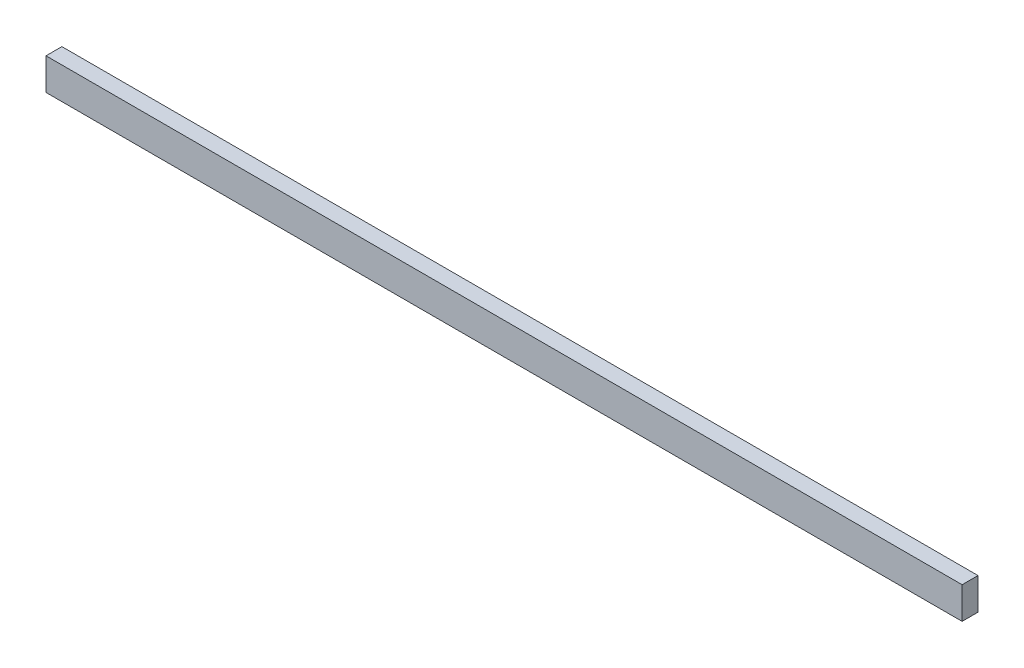
ISO-10303-21;
HEADER;
FILE_DESCRIPTION(('STEP AP214'),'2;1');
FILE_NAME('part.step','',(''),(''),'','','');
FILE_SCHEMA(('AUTOMOTIVE_DESIGN { 1 0 10303 214 1 1 1 1 }'));
ENDSEC;
DATA;
#1=APPLICATION_CONTEXT('core data for automotive mechanical design processes');
#2=APPLICATION_PROTOCOL_DEFINITION('international standard','automotive_design',2000,#1);
#3=PRODUCT_CONTEXT('',#1,'mechanical');
#4=PRODUCT('Part','Part','',(#3));
#5=PRODUCT_RELATED_PRODUCT_CATEGORY('part','',(#4));
#6=PRODUCT_DEFINITION_FORMATION('','',#4);
#7=PRODUCT_DEFINITION_CONTEXT('part definition',#1,'design');
#8=PRODUCT_DEFINITION('design','',#6,#7);
#9=PRODUCT_DEFINITION_SHAPE('','',#8);
#10=(LENGTH_UNIT() NAMED_UNIT(*) SI_UNIT(.MILLI.,.METRE.));
#11=(NAMED_UNIT(*) PLANE_ANGLE_UNIT() SI_UNIT($,.RADIAN.));
#12=(NAMED_UNIT(*) SI_UNIT($,.STERADIAN.) SOLID_ANGLE_UNIT());
#13=UNCERTAINTY_MEASURE_WITH_UNIT(LENGTH_MEASURE(1.E-05),#10,'distance_accuracy_value','');
#14=(GEOMETRIC_REPRESENTATION_CONTEXT(3) GLOBAL_UNCERTAINTY_ASSIGNED_CONTEXT((#13)) GLOBAL_UNIT_ASSIGNED_CONTEXT((#10,
#11,#12)) REPRESENTATION_CONTEXT('',''));
#15=CARTESIAN_POINT('',(0.,0.,0.));
#16=DIRECTION('',(0.,0.,1.));
#17=DIRECTION('',(1.,0.,0.));
#18=AXIS2_PLACEMENT_3D('',#15,#16,#17);
#19=CARTESIAN_POINT('',(-549.275,0.,463.55));
#20=DIRECTION('',(0.,0.,-1.));
#21=DIRECTION('',(-1.,0.,0.));
#22=AXIS2_PLACEMENT_3D('',#19,#20,#21);
#23=PLANE('',#22);
#24=DIRECTION('',(0.,1.,0.));
#25=VECTOR('',#24,1.);
#26=CARTESIAN_POINT('',(549.275,0.,463.55));
#27=LINE('',#26,#25);
#28=CARTESIAN_POINT('',(549.275,0.,463.55));
#29=VERTEX_POINT('',#28);
#30=CARTESIAN_POINT('',(549.275,38.1,463.55));
#31=VERTEX_POINT('',#30);
#32=EDGE_CURVE('E19',#29,#31,#27,.T.);
#33=ORIENTED_EDGE('',*,*,#32,.F.);
#34=DIRECTION('',(1.,0.,0.));
#35=VECTOR('',#34,1.);
#36=CARTESIAN_POINT('',(0.,0.,463.55));
#37=LINE('',#36,#35);
#38=CARTESIAN_POINT('',(-549.275,0.,463.55));
#39=VERTEX_POINT('',#38);
#40=EDGE_CURVE('E79',#39,#29,#37,.T.);
#41=ORIENTED_EDGE('',*,*,#40,.F.);
#42=DIRECTION('',(0.,1.,0.));
#43=VECTOR('',#42,1.);
#44=CARTESIAN_POINT('',(-549.275,0.,463.55));
#45=LINE('',#44,#43);
#46=CARTESIAN_POINT('',(-549.275,38.1,463.55));
#47=VERTEX_POINT('',#46);
#48=EDGE_CURVE('E60',#47,#39,#45,.F.);
#49=ORIENTED_EDGE('',*,*,#48,.F.);
#50=DIRECTION('',(1.,0.,0.));
#51=VECTOR('',#50,1.);
#52=CARTESIAN_POINT('',(0.,38.1,463.55));
#53=LINE('',#52,#51);
#54=EDGE_CURVE('E54',#31,#47,#53,.F.);
#55=ORIENTED_EDGE('',*,*,#54,.F.);
#56=EDGE_LOOP('',(#33,#41,#49,#55));
#57=FACE_BOUND('',#56,.T.);
#58=ADVANCED_FACE('F16',(#57),#23,.T.);
#59=CARTESIAN_POINT('',(549.275,0.,463.55));
#60=DIRECTION('',(1.,0.,0.));
#61=DIRECTION('',(0.,0.,-1.));
#62=AXIS2_PLACEMENT_3D('',#59,#60,#61);
#63=PLANE('',#62);
#64=DIRECTION('',(0.,1.,0.));
#65=VECTOR('',#64,1.);
#66=CARTESIAN_POINT('',(549.275,0.,482.6));
#67=LINE('',#66,#65);
#68=CARTESIAN_POINT('',(549.275,0.,482.6));
#69=VERTEX_POINT('',#68);
#70=CARTESIAN_POINT('',(549.275,38.1,482.6));
#71=VERTEX_POINT('',#70);
#72=EDGE_CURVE('E82',#69,#71,#67,.T.);
#73=ORIENTED_EDGE('',*,*,#72,.F.);
#74=DIRECTION('',(0.,0.,-1.));
#75=VECTOR('',#74,1.);
#76=CARTESIAN_POINT('',(549.275,0.,0.));
#77=LINE('',#76,#75);
#78=EDGE_CURVE('E67',#29,#69,#77,.F.);
#79=ORIENTED_EDGE('',*,*,#78,.F.);
#80=ORIENTED_EDGE('',*,*,#32,.T.);
#81=DIRECTION('',(0.,0.,1.));
#82=VECTOR('',#81,1.);
#83=CARTESIAN_POINT('',(549.275,38.1,0.));
#84=LINE('',#83,#82);
#85=EDGE_CURVE('E62',#71,#31,#84,.F.);
#86=ORIENTED_EDGE('',*,*,#85,.F.);
#87=EDGE_LOOP('',(#73,#79,#80,#86));
#88=FACE_BOUND('',#87,.T.);
#89=ADVANCED_FACE('F64',(#88),#63,.T.);
#90=CARTESIAN_POINT('',(0.,38.1,0.));
#91=DIRECTION('',(0.,1.,0.));
#92=DIRECTION('',(0.,0.,1.));
#93=AXIS2_PLACEMENT_3D('',#90,#91,#92);
#94=PLANE('',#93);
#95=DIRECTION('',(1.,0.,0.));
#96=VECTOR('',#95,1.);
#97=CARTESIAN_POINT('',(549.275,38.1,482.6));
#98=LINE('',#97,#96);
#99=CARTESIAN_POINT('',(-549.275,38.1,482.6));
#100=VERTEX_POINT('',#99);
#101=EDGE_CURVE('E71',#71,#100,#98,.F.);
#102=ORIENTED_EDGE('',*,*,#101,.F.);
#103=ORIENTED_EDGE('',*,*,#85,.T.);
#104=ORIENTED_EDGE('',*,*,#54,.T.);
#105=DIRECTION('',(0.,0.,1.));
#106=VECTOR('',#105,1.);
#107=CARTESIAN_POINT('',(-549.275,38.1,482.6));
#108=LINE('',#107,#106);
#109=EDGE_CURVE('E73',#100,#47,#108,.F.);
#110=ORIENTED_EDGE('',*,*,#109,.F.);
#111=EDGE_LOOP('',(#102,#103,#104,#110));
#112=FACE_BOUND('',#111,.T.);
#113=ADVANCED_FACE('F69',(#112),#94,.T.);
#114=CARTESIAN_POINT('',(-549.275,0.,482.6));
#115=DIRECTION('',(-1.,0.,0.));
#116=DIRECTION('',(0.,0.,1.));
#117=AXIS2_PLACEMENT_3D('',#114,#115,#116);
#118=PLANE('',#117);
#119=ORIENTED_EDGE('',*,*,#48,.T.);
#120=DIRECTION('',(0.,0.,-1.));
#121=VECTOR('',#120,1.);
#122=CARTESIAN_POINT('',(-549.275,0.,0.));
#123=LINE('',#122,#121);
#124=CARTESIAN_POINT('',(-549.275,0.,482.6));
#125=VERTEX_POINT('',#124);
#126=EDGE_CURVE('E34',#125,#39,#123,.T.);
#127=ORIENTED_EDGE('',*,*,#126,.F.);
#128=DIRECTION('',(0.,1.,0.));
#129=VECTOR('',#128,1.);
#130=CARTESIAN_POINT('',(-549.275,0.,482.6));
#131=LINE('',#130,#129);
#132=EDGE_CURVE('E25',#100,#125,#131,.F.);
#133=ORIENTED_EDGE('',*,*,#132,.F.);
#134=ORIENTED_EDGE('',*,*,#109,.T.);
#135=EDGE_LOOP('',(#119,#127,#133,#134));
#136=FACE_BOUND('',#135,.T.);
#137=ADVANCED_FACE('F88',(#136),#118,.T.);
#138=CARTESIAN_POINT('',(0.,0.,0.));
#139=DIRECTION('',(0.,-1.,0.));
#140=DIRECTION('',(0.,0.,-1.));
#141=AXIS2_PLACEMENT_3D('',#138,#139,#140);
#142=PLANE('',#141);
#143=ORIENTED_EDGE('',*,*,#40,.T.);
#144=ORIENTED_EDGE('',*,*,#78,.T.);
#145=DIRECTION('',(1.,0.,0.));
#146=VECTOR('',#145,1.);
#147=CARTESIAN_POINT('',(549.275,0.,482.6));
#148=LINE('',#147,#146);
#149=EDGE_CURVE('E11',#125,#69,#148,.T.);
#150=ORIENTED_EDGE('',*,*,#149,.F.);
#151=ORIENTED_EDGE('',*,*,#126,.T.);
#152=EDGE_LOOP('',(#143,#144,#150,#151));
#153=FACE_BOUND('',#152,.T.);
#154=ADVANCED_FACE('F90',(#153),#142,.T.);
#155=CARTESIAN_POINT('',(549.275,0.,482.6));
#156=DIRECTION('',(0.,0.,1.));
#157=DIRECTION('',(1.,0.,0.));
#158=AXIS2_PLACEMENT_3D('',#155,#156,#157);
#159=PLANE('',#158);
#160=ORIENTED_EDGE('',*,*,#132,.T.);
#161=ORIENTED_EDGE('',*,*,#149,.T.);
#162=ORIENTED_EDGE('',*,*,#72,.T.);
#163=ORIENTED_EDGE('',*,*,#101,.T.);
#164=EDGE_LOOP('',(#160,#161,#162,#163));
#165=FACE_BOUND('',#164,.T.);
#166=ADVANCED_FACE('F87',(#165),#159,.T.);
#167=CLOSED_SHELL('',(#58,#89,#113,#137,#154,#166));
#168=MANIFOLD_SOLID_BREP('B1',#167);
#169=ADVANCED_BREP_SHAPE_REPRESENTATION('',(#18,#168),#14);
#170=SHAPE_DEFINITION_REPRESENTATION(#9,#169);
ENDSEC;
END-ISO-10303-21;
